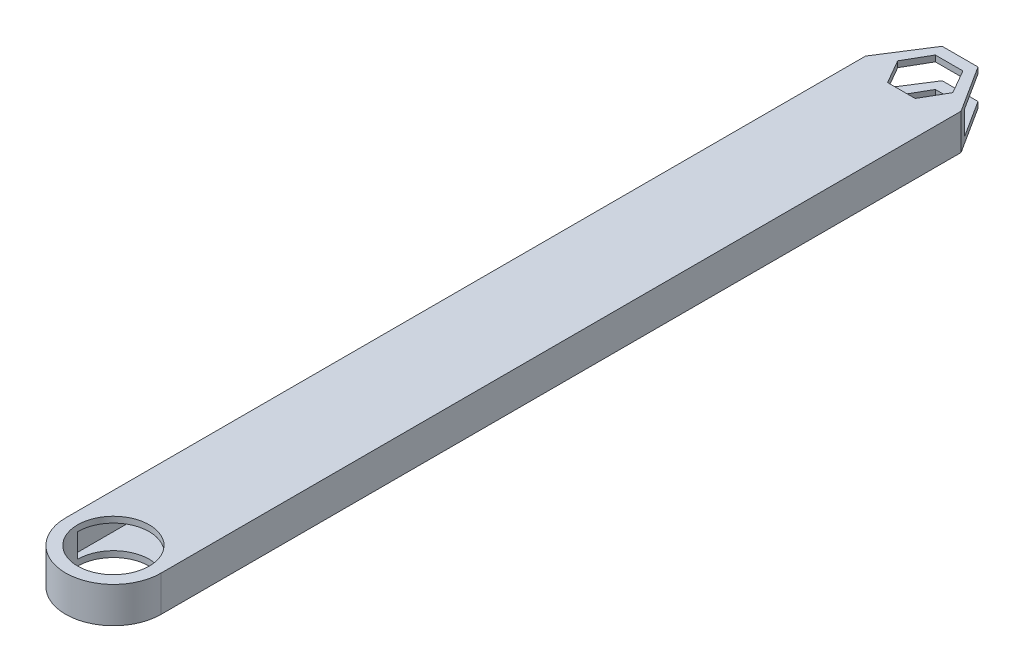
ISO-10303-21;
HEADER;
FILE_DESCRIPTION(('STEP AP214'),'2;1');
FILE_NAME('part.step','',(''),(''),'','','');
FILE_SCHEMA(('AUTOMOTIVE_DESIGN { 1 0 10303 214 1 1 1 1 }'));
ENDSEC;
DATA;
#1=APPLICATION_CONTEXT('core data for automotive mechanical design processes');
#2=APPLICATION_PROTOCOL_DEFINITION('international standard','automotive_design',2000,#1);
#3=PRODUCT_CONTEXT('',#1,'mechanical');
#4=PRODUCT('Part','Part','',(#3));
#5=PRODUCT_RELATED_PRODUCT_CATEGORY('part','',(#4));
#6=PRODUCT_DEFINITION_FORMATION('','',#4);
#7=PRODUCT_DEFINITION_CONTEXT('part definition',#1,'design');
#8=PRODUCT_DEFINITION('design','',#6,#7);
#9=PRODUCT_DEFINITION_SHAPE('','',#8);
#10=(LENGTH_UNIT() NAMED_UNIT(*) SI_UNIT(.MILLI.,.METRE.));
#11=(NAMED_UNIT(*) PLANE_ANGLE_UNIT() SI_UNIT($,.RADIAN.));
#12=(NAMED_UNIT(*) SI_UNIT($,.STERADIAN.) SOLID_ANGLE_UNIT());
#13=UNCERTAINTY_MEASURE_WITH_UNIT(LENGTH_MEASURE(1.E-05),#10,'distance_accuracy_value','');
#14=(GEOMETRIC_REPRESENTATION_CONTEXT(3) GLOBAL_UNCERTAINTY_ASSIGNED_CONTEXT((#13)) GLOBAL_UNIT_ASSIGNED_CONTEXT((#10,
#11,#12)) REPRESENTATION_CONTEXT('',''));
#15=CARTESIAN_POINT('',(0.,0.,0.));
#16=DIRECTION('',(0.,0.,1.));
#17=DIRECTION('',(1.,0.,0.));
#18=AXIS2_PLACEMENT_3D('',#15,#16,#17);
#19=CARTESIAN_POINT('',(0.,0.,228.6));
#20=DIRECTION('',(0.,0.,-1.));
#21=DIRECTION('',(-1.,0.,0.));
#22=AXIS2_PLACEMENT_3D('',#19,#20,#21);
#23=PLANE('',#22);
#24=DIRECTION('',(0.,1.,0.));
#25=VECTOR('',#24,1.);
#26=CARTESIAN_POINT('',(3.175,0.,228.6));
#27=LINE('',#26,#25);
#28=CARTESIAN_POINT('',(3.175,1.5875,228.6));
#29=VERTEX_POINT('',#28);
#30=CARTESIAN_POINT('',(3.175,7.9375,228.6));
#31=VERTEX_POINT('',#30);
#32=EDGE_CURVE('E11',#29,#31,#27,.T.);
#33=ORIENTED_EDGE('',*,*,#32,.F.);
#34=DIRECTION('',(1.,0.,0.));
#35=VECTOR('',#34,1.);
#36=CARTESIAN_POINT('',(1.5875,1.5875,228.6));
#37=LINE('',#36,#35);
#38=CARTESIAN_POINT('',(1.5875,1.5875,228.6));
#39=VERTEX_POINT('',#38);
#40=EDGE_CURVE('E221',#39,#29,#37,.T.);
#41=ORIENTED_EDGE('',*,*,#40,.F.);
#42=DIRECTION('',(0.,-1.,0.));
#43=VECTOR('',#42,1.);
#44=CARTESIAN_POINT('',(1.5875,7.9375,228.6));
#45=LINE('',#44,#43);
#46=CARTESIAN_POINT('',(1.5875,7.9375,228.6));
#47=VERTEX_POINT('',#46);
#48=EDGE_CURVE('E228',#47,#39,#45,.T.);
#49=ORIENTED_EDGE('',*,*,#48,.F.);
#50=DIRECTION('',(-1.,0.,0.));
#51=VECTOR('',#50,1.);
#52=CARTESIAN_POINT('',(23.8125,7.9375,228.6));
#53=LINE('',#52,#51);
#54=EDGE_CURVE('E385',#31,#47,#53,.T.);
#55=ORIENTED_EDGE('',*,*,#54,.F.);
#56=EDGE_LOOP('',(#33,#41,#49,#55));
#57=FACE_BOUND('',#56,.T.);
#58=ADVANCED_FACE('F35',(#57),#23,.T.);
#59=CARTESIAN_POINT('',(0.,0.,228.6));
#60=DIRECTION('',(1.,0.,0.));
#61=DIRECTION('',(0.,0.,-1.));
#62=AXIS2_PLACEMENT_3D('',#59,#60,#61);
#63=PLANE('',#62);
#64=DIRECTION('',(0.,0.,-1.));
#65=VECTOR('',#64,1.);
#66=CARTESIAN_POINT('',(0.,9.525,228.6));
#67=LINE('',#66,#65);
#68=CARTESIAN_POINT('',(0.,9.525,228.6));
#69=VERTEX_POINT('',#68);
#70=CARTESIAN_POINT('',(0.,9.525,15.875));
#71=VERTEX_POINT('',#70);
#72=EDGE_CURVE('E252',#69,#71,#67,.T.);
#73=ORIENTED_EDGE('',*,*,#72,.T.);
#74=DIRECTION('',(0.,1.,0.));
#75=VECTOR('',#74,1.);
#76=CARTESIAN_POINT('',(0.,0.,15.875));
#77=LINE('',#76,#75);
#78=CARTESIAN_POINT('',(0.,0.,15.875));
#79=VERTEX_POINT('',#78);
#80=EDGE_CURVE('E57',#79,#71,#77,.T.);
#81=ORIENTED_EDGE('',*,*,#80,.F.);
#82=DIRECTION('',(0.,0.,-1.));
#83=VECTOR('',#82,1.);
#84=CARTESIAN_POINT('',(0.,0.,228.6));
#85=LINE('',#84,#83);
#86=CARTESIAN_POINT('',(0.,0.,228.6));
#87=VERTEX_POINT('',#86);
#88=EDGE_CURVE('E261',#87,#79,#85,.T.);
#89=ORIENTED_EDGE('',*,*,#88,.F.);
#90=DIRECTION('',(0.,-1.,0.));
#91=VECTOR('',#90,1.);
#92=CARTESIAN_POINT('',(0.,0.,228.6));
#93=LINE('',#92,#91);
#94=EDGE_CURVE('E240',#69,#87,#93,.T.);
#95=ORIENTED_EDGE('',*,*,#94,.F.);
#96=EDGE_LOOP('',(#73,#81,#89,#95));
#97=FACE_BOUND('',#96,.T.);
#98=ADVANCED_FACE('F37',(#97),#63,.F.);
#99=CARTESIAN_POINT('',(0.,0.,228.6));
#100=DIRECTION('',(0.,1.,0.));
#101=DIRECTION('',(0.,0.,1.));
#102=AXIS2_PLACEMENT_3D('',#99,#100,#101);
#103=PLANE('',#102);
#104=CARTESIAN_POINT('',(12.7,0.,228.6));
#105=DIRECTION('',(0.,1.,0.));
#106=DIRECTION('',(0.,0.,1.));
#107=AXIS2_PLACEMENT_3D('',#104,#105,#106);
#108=CIRCLE('',#107,9.525);
#109=CARTESIAN_POINT('',(12.7,0.,238.125));
#110=VERTEX_POINT('',#109);
#111=EDGE_CURVE('E222',#110,#110,#108,.T.);
#112=ORIENTED_EDGE('',*,*,#111,.T.);
#113=EDGE_LOOP('',(#112));
#114=FACE_BOUND('',#113,.T.);
#115=DIRECTION('',(-0.5,0.,0.866025403784439));
#116=VECTOR('',#115,1.);
#117=CARTESIAN_POINT('',(20.0323484187082,0.,12.7));
#118=LINE('',#117,#116);
#119=CARTESIAN_POINT('',(20.0323484187082,0.,12.7));
#120=VERTEX_POINT('',#119);
#121=CARTESIAN_POINT('',(16.3661742093541,0.,19.05));
#122=VERTEX_POINT('',#121);
#123=EDGE_CURVE('E332',#120,#122,#118,.T.);
#124=ORIENTED_EDGE('',*,*,#123,.F.);
#125=DIRECTION('',(0.499999999999999,0.,0.866025403784439));
#126=VECTOR('',#125,1.);
#127=CARTESIAN_POINT('',(16.3661742093541,0.,6.35));
#128=LINE('',#127,#126);
#129=CARTESIAN_POINT('',(16.3661742093541,0.,6.35));
#130=VERTEX_POINT('',#129);
#131=EDGE_CURVE('E304',#130,#120,#128,.T.);
#132=ORIENTED_EDGE('',*,*,#131,.F.);
#133=DIRECTION('',(1.,0.,0.));
#134=VECTOR('',#133,1.);
#135=CARTESIAN_POINT('',(9.03382579064587,0.,6.35));
#136=LINE('',#135,#134);
#137=CARTESIAN_POINT('',(9.03382579064587,0.,6.35));
#138=VERTEX_POINT('',#137);
#139=EDGE_CURVE('E315',#138,#130,#136,.T.);
#140=ORIENTED_EDGE('',*,*,#139,.F.);
#141=DIRECTION('',(0.5,0.,-0.866025403784439));
#142=VECTOR('',#141,1.);
#143=CARTESIAN_POINT('',(5.36765158129175,0.,12.7));
#144=LINE('',#143,#142);
#145=CARTESIAN_POINT('',(5.36765158129175,0.,12.7));
#146=VERTEX_POINT('',#145);
#147=EDGE_CURVE('E341',#146,#138,#144,.T.);
#148=ORIENTED_EDGE('',*,*,#147,.F.);
#149=DIRECTION('',(-0.5,0.,-0.866025403784439));
#150=VECTOR('',#149,1.);
#151=CARTESIAN_POINT('',(9.03382579064587,0.,19.05));
#152=LINE('',#151,#150);
#153=CARTESIAN_POINT('',(9.03382579064587,0.,19.05));
#154=VERTEX_POINT('',#153);
#155=EDGE_CURVE('E338',#154,#146,#152,.T.);
#156=ORIENTED_EDGE('',*,*,#155,.F.);
#157=DIRECTION('',(-1.,0.,0.));
#158=VECTOR('',#157,1.);
#159=CARTESIAN_POINT('',(16.3661742093541,0.,19.05));
#160=LINE('',#159,#158);
#161=EDGE_CURVE('E335',#122,#154,#160,.T.);
#162=ORIENTED_EDGE('',*,*,#161,.F.);
#163=EDGE_LOOP('',(#124,#132,#140,#148,#156,#162));
#164=FACE_BOUND('',#163,.T.);
#165=DIRECTION('',(1.,0.,0.));
#166=VECTOR('',#165,1.);
#167=CARTESIAN_POINT('',(17.4625,0.,3.43247813906236));
#168=LINE('',#167,#166);
#169=CARTESIAN_POINT('',(7.9375,0.,3.43247813906236));
#170=VERTEX_POINT('',#169);
#171=CARTESIAN_POINT('',(17.4625,0.,3.43247813906236));
#172=VERTEX_POINT('',#171);
#173=EDGE_CURVE('E423',#170,#172,#168,.T.);
#174=ORIENTED_EDGE('',*,*,#173,.T.);
#175=DIRECTION('',(0.537817098940404,0.,0.843061544661674));
#176=VECTOR('',#175,1.);
#177=CARTESIAN_POINT('',(25.4,0.,15.875));
#178=LINE('',#177,#176);
#179=CARTESIAN_POINT('',(25.4,0.,15.875));
#180=VERTEX_POINT('',#179);
#181=EDGE_CURVE('E407',#172,#180,#178,.T.);
#182=ORIENTED_EDGE('',*,*,#181,.T.);
#183=DIRECTION('',(0.,0.,-1.));
#184=VECTOR('',#183,1.);
#185=CARTESIAN_POINT('',(25.4,0.,228.6));
#186=LINE('',#185,#184);
#187=CARTESIAN_POINT('',(25.4,0.,228.6));
#188=VERTEX_POINT('',#187);
#189=EDGE_CURVE('E258',#188,#180,#186,.T.);
#190=ORIENTED_EDGE('',*,*,#189,.F.);
#191=CARTESIAN_POINT('',(12.7,0.,228.6));
#192=DIRECTION('',(0.,1.,0.));
#193=DIRECTION('',(0.,0.,1.));
#194=AXIS2_PLACEMENT_3D('',#191,#192,#193);
#195=CIRCLE('',#194,12.7);
#196=EDGE_CURVE('E420',#87,#188,#195,.T.);
#197=ORIENTED_EDGE('',*,*,#196,.F.);
#198=ORIENTED_EDGE('',*,*,#88,.T.);
#199=DIRECTION('',(0.537817098940404,0.,-0.843061544661674));
#200=VECTOR('',#199,1.);
#201=CARTESIAN_POINT('',(7.9375,0.,3.43247813906236));
#202=LINE('',#201,#200);
#203=EDGE_CURVE('E414',#79,#170,#202,.T.);
#204=ORIENTED_EDGE('',*,*,#203,.T.);
#205=EDGE_LOOP('',(#174,#182,#190,#197,#198,#204));
#206=FACE_BOUND('',#205,.T.);
#207=ADVANCED_FACE('F440',(#114,#164,#206),#103,.F.);
#208=CARTESIAN_POINT('',(25.4,0.,228.6));
#209=DIRECTION('',(-1.,0.,0.));
#210=DIRECTION('',(0.,0.,1.));
#211=AXIS2_PLACEMENT_3D('',#208,#209,#210);
#212=PLANE('',#211);
#213=ORIENTED_EDGE('',*,*,#189,.T.);
#214=DIRECTION('',(0.,1.,0.));
#215=VECTOR('',#214,1.);
#216=CARTESIAN_POINT('',(25.4,0.,15.875));
#217=LINE('',#216,#215);
#218=CARTESIAN_POINT('',(25.4,9.525,15.875));
#219=VERTEX_POINT('',#218);
#220=EDGE_CURVE('E400',#180,#219,#217,.T.);
#221=ORIENTED_EDGE('',*,*,#220,.T.);
#222=DIRECTION('',(0.,0.,-1.));
#223=VECTOR('',#222,1.);
#224=CARTESIAN_POINT('',(25.4,9.525,228.6));
#225=LINE('',#224,#223);
#226=CARTESIAN_POINT('',(25.4,9.525,228.6));
#227=VERTEX_POINT('',#226);
#228=EDGE_CURVE('E255',#227,#219,#225,.T.);
#229=ORIENTED_EDGE('',*,*,#228,.F.);
#230=DIRECTION('',(0.,1.,0.));
#231=VECTOR('',#230,1.);
#232=CARTESIAN_POINT('',(25.4,0.,228.6));
#233=LINE('',#232,#231);
#234=EDGE_CURVE('E249',#188,#227,#233,.T.);
#235=ORIENTED_EDGE('',*,*,#234,.F.);
#236=EDGE_LOOP('',(#213,#221,#229,#235));
#237=FACE_BOUND('',#236,.T.);
#238=ADVANCED_FACE('F451',(#237),#212,.F.);
#239=CARTESIAN_POINT('',(0.,9.525,228.6));
#240=DIRECTION('',(0.,-1.,0.));
#241=DIRECTION('',(0.,0.,-1.));
#242=AXIS2_PLACEMENT_3D('',#239,#240,#241);
#243=PLANE('',#242);
#244=CARTESIAN_POINT('',(12.7,9.525,228.6));
#245=DIRECTION('',(0.,1.,0.));
#246=DIRECTION('',(0.,0.,1.));
#247=AXIS2_PLACEMENT_3D('',#244,#245,#246);
#248=CIRCLE('',#247,9.525);
#249=CARTESIAN_POINT('',(12.7,9.525,238.125));
#250=VERTEX_POINT('',#249);
#251=EDGE_CURVE('E434',#250,#250,#248,.T.);
#252=ORIENTED_EDGE('',*,*,#251,.F.);
#253=EDGE_LOOP('',(#252));
#254=FACE_BOUND('',#253,.T.);
#255=DIRECTION('',(1.,0.,0.));
#256=VECTOR('',#255,1.);
#257=CARTESIAN_POINT('',(9.03382579064587,9.525,6.35));
#258=LINE('',#257,#256);
#259=CARTESIAN_POINT('',(9.03382579064587,9.525,6.35));
#260=VERTEX_POINT('',#259);
#261=CARTESIAN_POINT('',(16.3661742093541,9.525,6.35));
#262=VERTEX_POINT('',#261);
#263=EDGE_CURVE('E327',#260,#262,#258,.T.);
#264=ORIENTED_EDGE('',*,*,#263,.T.);
#265=DIRECTION('',(0.499999999999999,0.,0.866025403784439));
#266=VECTOR('',#265,1.);
#267=CARTESIAN_POINT('',(16.3661742093541,9.525,6.35));
#268=LINE('',#267,#266);
#269=CARTESIAN_POINT('',(20.0323484187082,9.525,12.7));
#270=VERTEX_POINT('',#269);
#271=EDGE_CURVE('E311',#262,#270,#268,.T.);
#272=ORIENTED_EDGE('',*,*,#271,.T.);
#273=DIRECTION('',(-0.5,0.,0.866025403784439));
#274=VECTOR('',#273,1.);
#275=CARTESIAN_POINT('',(20.0323484187082,9.525,12.7));
#276=LINE('',#275,#274);
#277=CARTESIAN_POINT('',(16.3661742093541,9.525,19.05));
#278=VERTEX_POINT('',#277);
#279=EDGE_CURVE('E314',#270,#278,#276,.T.);
#280=ORIENTED_EDGE('',*,*,#279,.T.);
#281=DIRECTION('',(-1.,0.,0.));
#282=VECTOR('',#281,1.);
#283=CARTESIAN_POINT('',(16.3661742093541,9.525,19.05));
#284=LINE('',#283,#282);
#285=CARTESIAN_POINT('',(9.03382579064587,9.525,19.05));
#286=VERTEX_POINT('',#285);
#287=EDGE_CURVE('E318',#278,#286,#284,.T.);
#288=ORIENTED_EDGE('',*,*,#287,.T.);
#289=DIRECTION('',(-0.5,0.,-0.866025403784439));
#290=VECTOR('',#289,1.);
#291=CARTESIAN_POINT('',(9.03382579064587,9.525,19.05));
#292=LINE('',#291,#290);
#293=CARTESIAN_POINT('',(5.36765158129175,9.525,12.7));
#294=VERTEX_POINT('',#293);
#295=EDGE_CURVE('E321',#286,#294,#292,.T.);
#296=ORIENTED_EDGE('',*,*,#295,.T.);
#297=DIRECTION('',(0.5,0.,-0.866025403784439));
#298=VECTOR('',#297,1.);
#299=CARTESIAN_POINT('',(5.36765158129175,9.525,12.7));
#300=LINE('',#299,#298);
#301=EDGE_CURVE('E324',#294,#260,#300,.T.);
#302=ORIENTED_EDGE('',*,*,#301,.T.);
#303=EDGE_LOOP('',(#264,#272,#280,#288,#296,#302));
#304=FACE_BOUND('',#303,.T.);
#305=ORIENTED_EDGE('',*,*,#228,.T.);
#306=DIRECTION('',(0.537817098940404,0.,0.843061544661674));
#307=VECTOR('',#306,1.);
#308=CARTESIAN_POINT('',(25.4,9.525,15.875));
#309=LINE('',#308,#307);
#310=CARTESIAN_POINT('',(17.4625,9.525,3.43247813906236));
#311=VERTEX_POINT('',#310);
#312=EDGE_CURVE('E412',#311,#219,#309,.T.);
#313=ORIENTED_EDGE('',*,*,#312,.F.);
#314=DIRECTION('',(1.,0.,0.));
#315=VECTOR('',#314,1.);
#316=CARTESIAN_POINT('',(17.4625,9.525,3.43247813906236));
#317=LINE('',#316,#315);
#318=CARTESIAN_POINT('',(7.9375,9.525,3.43247813906236));
#319=VERTEX_POINT('',#318);
#320=EDGE_CURVE('E415',#319,#311,#317,.T.);
#321=ORIENTED_EDGE('',*,*,#320,.F.);
#322=DIRECTION('',(0.537817098940404,0.,-0.843061544661674));
#323=VECTOR('',#322,1.);
#324=CARTESIAN_POINT('',(7.9375,9.525,3.43247813906236));
#325=LINE('',#324,#323);
#326=EDGE_CURVE('E418',#71,#319,#325,.T.);
#327=ORIENTED_EDGE('',*,*,#326,.F.);
#328=ORIENTED_EDGE('',*,*,#72,.F.);
#329=CARTESIAN_POINT('',(12.7,9.525,228.6));
#330=DIRECTION('',(0.,1.,0.));
#331=DIRECTION('',(0.,0.,1.));
#332=AXIS2_PLACEMENT_3D('',#329,#330,#331);
#333=CIRCLE('',#332,12.7);
#334=EDGE_CURVE('E428',#69,#227,#333,.T.);
#335=ORIENTED_EDGE('',*,*,#334,.T.);
#336=EDGE_LOOP('',(#305,#313,#321,#327,#328,#335));
#337=FACE_BOUND('',#336,.T.);
#338=ADVANCED_FACE('F448',(#254,#304,#337),#243,.F.);
#339=CARTESIAN_POINT('',(23.8125,7.9375,0.));
#340=DIRECTION('',(0.,1.,0.));
#341=DIRECTION('',(0.,0.,1.));
#342=AXIS2_PLACEMENT_3D('',#339,#340,#341);
#343=PLANE('',#342);
#344=DIRECTION('',(0.5,0.,-0.866025403784439));
#345=VECTOR('',#344,1.);
#346=CARTESIAN_POINT('',(26.4766476280624,7.9375,1.53814635022271));
#347=LINE('',#346,#345);
#348=CARTESIAN_POINT('',(16.3661742093541,7.9375,19.05));
#349=VERTEX_POINT('',#348);
#350=CARTESIAN_POINT('',(20.0323484187082,7.9375,12.7));
#351=VERTEX_POINT('',#350);
#352=EDGE_CURVE('E349',#349,#351,#347,.T.);
#353=ORIENTED_EDGE('',*,*,#352,.T.);
#354=DIRECTION('',(-0.499999999999999,0.,-0.866025403784439));
#355=VECTOR('',#354,1.);
#356=CARTESIAN_POINT('',(15.478125,7.9375,4.81185364977728));
#357=LINE('',#356,#355);
#358=CARTESIAN_POINT('',(16.3661742093541,7.9375,6.35));
#359=VERTEX_POINT('',#358);
#360=EDGE_CURVE('E383',#351,#359,#357,.T.);
#361=ORIENTED_EDGE('',*,*,#360,.T.);
#362=DIRECTION('',(-1.,0.,0.));
#363=VECTOR('',#362,1.);
#364=CARTESIAN_POINT('',(23.8125,7.9375,6.35));
#365=LINE('',#364,#363);
#366=CARTESIAN_POINT('',(9.03382579064587,7.9375,6.35));
#367=VERTEX_POINT('',#366);
#368=EDGE_CURVE('E380',#359,#367,#365,.T.);
#369=ORIENTED_EDGE('',*,*,#368,.T.);
#370=DIRECTION('',(-0.5,0.,0.866025403784439));
#371=VECTOR('',#370,1.);
#372=CARTESIAN_POINT('',(15.478125,7.9375,-4.81185364977729));
#373=LINE('',#372,#371);
#374=CARTESIAN_POINT('',(5.36765158129175,7.9375,12.7));
#375=VERTEX_POINT('',#374);
#376=EDGE_CURVE('E377',#367,#375,#373,.T.);
#377=ORIENTED_EDGE('',*,*,#376,.T.);
#378=DIRECTION('',(0.5,0.,0.866025403784439));
#379=VECTOR('',#378,1.);
#380=CARTESIAN_POINT('',(4.47960237193762,7.9375,11.1618536497773));
#381=LINE('',#380,#379);
#382=CARTESIAN_POINT('',(9.03382579064587,7.9375,19.05));
#383=VERTEX_POINT('',#382);
#384=EDGE_CURVE('E374',#375,#383,#381,.T.);
#385=ORIENTED_EDGE('',*,*,#384,.T.);
#386=DIRECTION('',(1.,0.,0.));
#387=VECTOR('',#386,1.);
#388=CARTESIAN_POINT('',(23.8125,7.9375,19.05));
#389=LINE('',#388,#387);
#390=EDGE_CURVE('E371',#383,#349,#389,.T.);
#391=ORIENTED_EDGE('',*,*,#390,.T.);
#392=EDGE_LOOP('',(#353,#361,#369,#377,#385,#391));
#393=FACE_BOUND('',#392,.T.);
#394=CARTESIAN_POINT('',(23.8125,7.9375,228.6));
#395=VERTEX_POINT('',#394);
#396=CARTESIAN_POINT('',(22.225,7.9375,228.6));
#397=VERTEX_POINT('',#396);
#398=EDGE_CURVE('E231',#395,#397,#53,.T.);
#399=ORIENTED_EDGE('',*,*,#398,.T.);
#400=CARTESIAN_POINT('',(12.7,7.9375,228.6));
#401=DIRECTION('',(0.,1.,0.));
#402=DIRECTION('',(0.,0.,1.));
#403=AXIS2_PLACEMENT_3D('',#400,#401,#402);
#404=CIRCLE('',#403,9.525);
#405=EDGE_CURVE('E49',#397,#31,#404,.T.);
#406=ORIENTED_EDGE('',*,*,#405,.T.);
#407=ORIENTED_EDGE('',*,*,#54,.T.);
#408=DIRECTION('',(0.,0.,1.));
#409=VECTOR('',#408,1.);
#410=CARTESIAN_POINT('',(1.5875,7.9375,0.));
#411=LINE('',#410,#409);
#412=CARTESIAN_POINT('',(1.5875,7.9375,13.3864956278125));
#413=VERTEX_POINT('',#412);
#414=EDGE_CURVE('E236',#413,#47,#411,.T.);
#415=ORIENTED_EDGE('',*,*,#414,.F.);
#416=DIRECTION('',(0.537817098940404,0.,-0.843061544661674));
#417=VECTOR('',#416,1.);
#418=CARTESIAN_POINT('',(14.0856297224988,7.9375,-6.2050952122537));
#419=LINE('',#418,#417);
#420=CARTESIAN_POINT('',(7.9375,7.9375,3.43247813906236));
#421=VERTEX_POINT('',#420);
#422=EDGE_CURVE('E307',#413,#421,#419,.T.);
#423=ORIENTED_EDGE('',*,*,#422,.T.);
#424=DIRECTION('',(1.,0.,0.));
#425=VECTOR('',#424,1.);
#426=CARTESIAN_POINT('',(23.8125,7.9375,3.43247813906236));
#427=LINE('',#426,#425);
#428=CARTESIAN_POINT('',(17.4625,7.9375,3.43247813906236));
#429=VERTEX_POINT('',#428);
#430=EDGE_CURVE('E302',#421,#429,#427,.T.);
#431=ORIENTED_EDGE('',*,*,#430,.T.);
#432=DIRECTION('',(0.537817098940404,0.,0.843061544661674));
#433=VECTOR('',#432,1.);
#434=CARTESIAN_POINT('',(17.7428900067604,7.9375,3.87200680535585));
#435=LINE('',#434,#433);
#436=CARTESIAN_POINT('',(23.8125,7.9375,13.3864956278125));
#437=VERTEX_POINT('',#436);
#438=EDGE_CURVE('E301',#429,#437,#435,.T.);
#439=ORIENTED_EDGE('',*,*,#438,.T.);
#440=DIRECTION('',(0.,0.,1.));
#441=VECTOR('',#440,1.);
#442=CARTESIAN_POINT('',(23.8125,7.9375,0.));
#443=LINE('',#442,#441);
#444=EDGE_CURVE('E237',#437,#395,#443,.T.);
#445=ORIENTED_EDGE('',*,*,#444,.T.);
#446=EDGE_LOOP('',(#399,#406,#407,#415,#423,#431,#439,#445));
#447=FACE_BOUND('',#446,.T.);
#448=ADVANCED_FACE('F390',(#393,#447),#343,.F.);
#449=CARTESIAN_POINT('',(23.8125,1.5875,0.));
#450=DIRECTION('',(1.,0.,0.));
#451=DIRECTION('',(0.,0.,-1.));
#452=AXIS2_PLACEMENT_3D('',#449,#450,#451);
#453=PLANE('',#452);
#454=ORIENTED_EDGE('',*,*,#444,.F.);
#455=DIRECTION('',(0.,-1.,0.));
#456=VECTOR('',#455,1.);
#457=CARTESIAN_POINT('',(23.8125,1.5875,13.3864956278125));
#458=LINE('',#457,#456);
#459=CARTESIAN_POINT('',(23.8125,1.5875,13.3864956278125));
#460=VERTEX_POINT('',#459);
#461=EDGE_CURVE('E294',#437,#460,#458,.T.);
#462=ORIENTED_EDGE('',*,*,#461,.T.);
#463=DIRECTION('',(0.,0.,1.));
#464=VECTOR('',#463,1.);
#465=CARTESIAN_POINT('',(23.8125,1.5875,0.));
#466=LINE('',#465,#464);
#467=CARTESIAN_POINT('',(23.8125,1.5875,228.6));
#468=VERTEX_POINT('',#467);
#469=EDGE_CURVE('E241',#460,#468,#466,.T.);
#470=ORIENTED_EDGE('',*,*,#469,.T.);
#471=DIRECTION('',(0.,1.,0.));
#472=VECTOR('',#471,1.);
#473=CARTESIAN_POINT('',(23.8125,1.5875,228.6));
#474=LINE('',#473,#472);
#475=EDGE_CURVE('E226',#468,#395,#474,.T.);
#476=ORIENTED_EDGE('',*,*,#475,.T.);
#477=EDGE_LOOP('',(#454,#462,#470,#476));
#478=FACE_BOUND('',#477,.T.);
#479=ADVANCED_FACE('F300',(#478),#453,.F.);
#480=CARTESIAN_POINT('',(1.5875,1.5875,0.));
#481=DIRECTION('',(0.,-1.,0.));
#482=DIRECTION('',(0.,0.,-1.));
#483=AXIS2_PLACEMENT_3D('',#480,#481,#482);
#484=PLANE('',#483);
#485=DIRECTION('',(1.,0.,0.));
#486=VECTOR('',#485,1.);
#487=CARTESIAN_POINT('',(1.5875,1.5875,6.35));
#488=LINE('',#487,#486);
#489=CARTESIAN_POINT('',(9.03382579064587,1.5875,6.35));
#490=VERTEX_POINT('',#489);
#491=CARTESIAN_POINT('',(16.3661742093541,1.5875,6.35));
#492=VERTEX_POINT('',#491);
#493=EDGE_CURVE('E276',#490,#492,#488,.T.);
#494=ORIENTED_EDGE('',*,*,#493,.T.);
#495=DIRECTION('',(0.499999999999999,0.,0.866025403784439));
#496=VECTOR('',#495,1.);
#497=CARTESIAN_POINT('',(9.92187500000001,1.5875,-4.81185364977729));
#498=LINE('',#497,#496);
#499=CARTESIAN_POINT('',(20.0323484187082,1.5875,12.7));
#500=VERTEX_POINT('',#499);
#501=EDGE_CURVE('E279',#492,#500,#498,.T.);
#502=ORIENTED_EDGE('',*,*,#501,.T.);
#503=DIRECTION('',(-0.5,0.,0.866025403784439));
#504=VECTOR('',#503,1.);
#505=CARTESIAN_POINT('',(20.9203976280624,1.5875,11.1618536497773));
#506=LINE('',#505,#504);
#507=CARTESIAN_POINT('',(16.3661742093541,1.5875,19.05));
#508=VERTEX_POINT('',#507);
#509=EDGE_CURVE('E264',#500,#508,#506,.T.);
#510=ORIENTED_EDGE('',*,*,#509,.T.);
#511=DIRECTION('',(-1.,0.,0.));
#512=VECTOR('',#511,1.);
#513=CARTESIAN_POINT('',(1.5875,1.5875,19.05));
#514=LINE('',#513,#512);
#515=CARTESIAN_POINT('',(9.03382579064587,1.5875,19.05));
#516=VERTEX_POINT('',#515);
#517=EDGE_CURVE('E267',#508,#516,#514,.T.);
#518=ORIENTED_EDGE('',*,*,#517,.T.);
#519=DIRECTION('',(-0.5,0.,-0.866025403784439));
#520=VECTOR('',#519,1.);
#521=CARTESIAN_POINT('',(-1.07664762806238,1.5875,1.53814635022272));
#522=LINE('',#521,#520);
#523=CARTESIAN_POINT('',(5.36765158129175,1.5875,12.7));
#524=VERTEX_POINT('',#523);
#525=EDGE_CURVE('E270',#516,#524,#522,.T.);
#526=ORIENTED_EDGE('',*,*,#525,.T.);
#527=DIRECTION('',(0.5,0.,-0.866025403784439));
#528=VECTOR('',#527,1.);
#529=CARTESIAN_POINT('',(9.921875,1.5875,4.81185364977728));
#530=LINE('',#529,#528);
#531=EDGE_CURVE('E273',#524,#490,#530,.T.);
#532=ORIENTED_EDGE('',*,*,#531,.T.);
#533=EDGE_LOOP('',(#494,#502,#510,#518,#526,#532));
#534=FACE_BOUND('',#533,.T.);
#535=ORIENTED_EDGE('',*,*,#40,.T.);
#536=CARTESIAN_POINT('',(12.7,1.5875,228.6));
#537=DIRECTION('',(0.,-1.,0.));
#538=DIRECTION('',(0.,0.,-1.));
#539=AXIS2_PLACEMENT_3D('',#536,#537,#538);
#540=CIRCLE('',#539,9.525);
#541=CARTESIAN_POINT('',(22.225,1.5875,228.6));
#542=VERTEX_POINT('',#541);
#543=EDGE_CURVE('E208',#29,#542,#540,.T.);
#544=ORIENTED_EDGE('',*,*,#543,.T.);
#545=EDGE_CURVE('E218',#542,#468,#37,.T.);
#546=ORIENTED_EDGE('',*,*,#545,.T.);
#547=ORIENTED_EDGE('',*,*,#469,.F.);
#548=DIRECTION('',(-0.537817098940404,0.,-0.843061544661674));
#549=VECTOR('',#548,1.);
#550=CARTESIAN_POINT('',(11.3143702775012,1.5875,-6.2050952122537));
#551=LINE('',#550,#549);
#552=CARTESIAN_POINT('',(17.4625,1.5875,3.43247813906236));
#553=VERTEX_POINT('',#552);
#554=EDGE_CURVE('E213',#460,#553,#551,.T.);
#555=ORIENTED_EDGE('',*,*,#554,.T.);
#556=DIRECTION('',(-1.,0.,0.));
#557=VECTOR('',#556,1.);
#558=CARTESIAN_POINT('',(1.5875,1.5875,3.43247813906236));
#559=LINE('',#558,#557);
#560=CARTESIAN_POINT('',(7.9375,1.5875,3.43247813906236));
#561=VERTEX_POINT('',#560);
#562=EDGE_CURVE('E285',#553,#561,#559,.T.);
#563=ORIENTED_EDGE('',*,*,#562,.T.);
#564=DIRECTION('',(-0.537817098940404,0.,0.843061544661674));
#565=VECTOR('',#564,1.);
#566=CARTESIAN_POINT('',(7.65710999323961,1.5875,3.87200680535585));
#567=LINE('',#566,#565);
#568=CARTESIAN_POINT('',(1.5875,1.5875,13.3864956278125));
#569=VERTEX_POINT('',#568);
#570=EDGE_CURVE('E397',#561,#569,#567,.T.);
#571=ORIENTED_EDGE('',*,*,#570,.T.);
#572=DIRECTION('',(0.,0.,1.));
#573=VECTOR('',#572,1.);
#574=CARTESIAN_POINT('',(1.5875,1.5875,0.));
#575=LINE('',#574,#573);
#576=EDGE_CURVE('E243',#569,#39,#575,.T.);
#577=ORIENTED_EDGE('',*,*,#576,.T.);
#578=EDGE_LOOP('',(#535,#544,#546,#547,#555,#563,#571,#577));
#579=FACE_BOUND('',#578,.T.);
#580=ADVANCED_FACE('F216',(#534,#579),#484,.F.);
#581=CARTESIAN_POINT('',(1.5875,7.9375,0.));
#582=DIRECTION('',(-1.,0.,0.));
#583=DIRECTION('',(0.,0.,1.));
#584=AXIS2_PLACEMENT_3D('',#581,#582,#583);
#585=PLANE('',#584);
#586=ORIENTED_EDGE('',*,*,#576,.F.);
#587=DIRECTION('',(0.,1.,0.));
#588=VECTOR('',#587,1.);
#589=CARTESIAN_POINT('',(1.5875,7.9375,13.3864956278125));
#590=LINE('',#589,#588);
#591=EDGE_CURVE('E282',#569,#413,#590,.T.);
#592=ORIENTED_EDGE('',*,*,#591,.T.);
#593=ORIENTED_EDGE('',*,*,#414,.T.);
#594=ORIENTED_EDGE('',*,*,#48,.T.);
#595=EDGE_LOOP('',(#586,#592,#593,#594));
#596=FACE_BOUND('',#595,.T.);
#597=ADVANCED_FACE('F395',(#596),#585,.F.);
#598=CARTESIAN_POINT('',(20.0323484187082,9.525,12.7));
#599=DIRECTION('',(0.866025403784439,0.,0.5));
#600=DIRECTION('',(0.5,0.,-0.866025403784439));
#601=AXIS2_PLACEMENT_3D('',#598,#599,#600);
#602=PLANE('',#601);
#603=DIRECTION('',(0.,-1.,0.));
#604=VECTOR('',#603,1.);
#605=CARTESIAN_POINT('',(20.0323484187082,9.525,12.7));
#606=LINE('',#605,#604);
#607=EDGE_CURVE('E330',#500,#120,#606,.T.);
#608=ORIENTED_EDGE('',*,*,#607,.T.);
#609=ORIENTED_EDGE('',*,*,#123,.T.);
#610=DIRECTION('',(0.,-1.,0.));
#611=VECTOR('',#610,1.);
#612=CARTESIAN_POINT('',(16.3661742093541,9.525,19.05));
#613=LINE('',#612,#611);
#614=EDGE_CURVE('E366',#508,#122,#613,.T.);
#615=ORIENTED_EDGE('',*,*,#614,.F.);
#616=ORIENTED_EDGE('',*,*,#509,.F.);
#617=EDGE_LOOP('',(#608,#609,#615,#616));
#618=FACE_BOUND('',#617,.T.);
#619=ADVANCED_FACE('F517',(#618),#602,.F.);
#620=CARTESIAN_POINT('',(16.3661742093541,9.525,19.05));
#621=DIRECTION('',(0.,0.,1.));
#622=DIRECTION('',(1.,0.,0.));
#623=AXIS2_PLACEMENT_3D('',#620,#621,#622);
#624=PLANE('',#623);
#625=ORIENTED_EDGE('',*,*,#614,.T.);
#626=ORIENTED_EDGE('',*,*,#161,.T.);
#627=DIRECTION('',(0.,-1.,0.));
#628=VECTOR('',#627,1.);
#629=CARTESIAN_POINT('',(9.03382579064587,9.525,19.05));
#630=LINE('',#629,#628);
#631=EDGE_CURVE('E362',#516,#154,#630,.T.);
#632=ORIENTED_EDGE('',*,*,#631,.F.);
#633=ORIENTED_EDGE('',*,*,#517,.F.);
#634=EDGE_LOOP('',(#625,#626,#632,#633));
#635=FACE_BOUND('',#634,.T.);
#636=ADVANCED_FACE('F513',(#635),#624,.F.);
#637=CARTESIAN_POINT('',(9.03382579064587,9.525,19.05));
#638=DIRECTION('',(-0.866025403784439,0.,0.5));
#639=DIRECTION('',(0.5,0.,0.866025403784439));
#640=AXIS2_PLACEMENT_3D('',#637,#638,#639);
#641=PLANE('',#640);
#642=ORIENTED_EDGE('',*,*,#631,.T.);
#643=ORIENTED_EDGE('',*,*,#155,.T.);
#644=DIRECTION('',(0.,-1.,0.));
#645=VECTOR('',#644,1.);
#646=CARTESIAN_POINT('',(5.36765158129175,9.525,12.7));
#647=LINE('',#646,#645);
#648=EDGE_CURVE('E358',#524,#146,#647,.T.);
#649=ORIENTED_EDGE('',*,*,#648,.F.);
#650=ORIENTED_EDGE('',*,*,#525,.F.);
#651=EDGE_LOOP('',(#642,#643,#649,#650));
#652=FACE_BOUND('',#651,.T.);
#653=ADVANCED_FACE('F508',(#652),#641,.F.);
#654=CARTESIAN_POINT('',(5.36765158129175,9.525,12.7));
#655=DIRECTION('',(-0.866025403784439,0.,-0.5));
#656=DIRECTION('',(-0.5,0.,0.866025403784439));
#657=AXIS2_PLACEMENT_3D('',#654,#655,#656);
#658=PLANE('',#657);
#659=ORIENTED_EDGE('',*,*,#648,.T.);
#660=ORIENTED_EDGE('',*,*,#147,.T.);
#661=DIRECTION('',(0.,-1.,0.));
#662=VECTOR('',#661,1.);
#663=CARTESIAN_POINT('',(9.03382579064587,9.525,6.35));
#664=LINE('',#663,#662);
#665=EDGE_CURVE('E354',#490,#138,#664,.T.);
#666=ORIENTED_EDGE('',*,*,#665,.F.);
#667=ORIENTED_EDGE('',*,*,#531,.F.);
#668=EDGE_LOOP('',(#659,#660,#666,#667));
#669=FACE_BOUND('',#668,.T.);
#670=ADVANCED_FACE('F503',(#669),#658,.F.);
#671=CARTESIAN_POINT('',(9.03382579064587,9.525,6.35));
#672=DIRECTION('',(0.,0.,-1.));
#673=DIRECTION('',(-1.,0.,0.));
#674=AXIS2_PLACEMENT_3D('',#671,#672,#673);
#675=PLANE('',#674);
#676=ORIENTED_EDGE('',*,*,#665,.T.);
#677=ORIENTED_EDGE('',*,*,#139,.T.);
#678=DIRECTION('',(0.,-1.,0.));
#679=VECTOR('',#678,1.);
#680=CARTESIAN_POINT('',(16.3661742093541,9.525,6.35));
#681=LINE('',#680,#679);
#682=EDGE_CURVE('E350',#492,#130,#681,.T.);
#683=ORIENTED_EDGE('',*,*,#682,.F.);
#684=ORIENTED_EDGE('',*,*,#493,.F.);
#685=EDGE_LOOP('',(#676,#677,#683,#684));
#686=FACE_BOUND('',#685,.T.);
#687=ADVANCED_FACE('F498',(#686),#675,.F.);
#688=CARTESIAN_POINT('',(16.3661742093541,9.525,6.35));
#689=DIRECTION('',(0.866025403784439,0.,-0.499999999999999));
#690=DIRECTION('',(-0.499999999999999,0.,-0.866025403784439));
#691=AXIS2_PLACEMENT_3D('',#688,#689,#690);
#692=PLANE('',#691);
#693=ORIENTED_EDGE('',*,*,#682,.T.);
#694=ORIENTED_EDGE('',*,*,#131,.T.);
#695=ORIENTED_EDGE('',*,*,#607,.F.);
#696=ORIENTED_EDGE('',*,*,#501,.F.);
#697=EDGE_LOOP('',(#693,#694,#695,#696));
#698=FACE_BOUND('',#697,.T.);
#699=ADVANCED_FACE('F520',(#698),#692,.F.);
#700=EDGE_CURVE('E367',#270,#351,#606,.T.);
#701=ORIENTED_EDGE('',*,*,#700,.F.);
#702=ORIENTED_EDGE('',*,*,#271,.F.);
#703=EDGE_CURVE('E346',#262,#359,#681,.T.);
#704=ORIENTED_EDGE('',*,*,#703,.T.);
#705=ORIENTED_EDGE('',*,*,#360,.F.);
#706=EDGE_LOOP('',(#701,#702,#704,#705));
#707=FACE_BOUND('',#706,.T.);
#708=ADVANCED_FACE('F496',(#707),#692,.F.);
#709=ORIENTED_EDGE('',*,*,#703,.F.);
#710=ORIENTED_EDGE('',*,*,#263,.F.);
#711=EDGE_CURVE('E351',#260,#367,#664,.T.);
#712=ORIENTED_EDGE('',*,*,#711,.T.);
#713=ORIENTED_EDGE('',*,*,#368,.F.);
#714=EDGE_LOOP('',(#709,#710,#712,#713));
#715=FACE_BOUND('',#714,.T.);
#716=ADVANCED_FACE('F492',(#715),#675,.F.);
#717=ORIENTED_EDGE('',*,*,#711,.F.);
#718=ORIENTED_EDGE('',*,*,#301,.F.);
#719=EDGE_CURVE('E355',#294,#375,#647,.T.);
#720=ORIENTED_EDGE('',*,*,#719,.T.);
#721=ORIENTED_EDGE('',*,*,#376,.F.);
#722=EDGE_LOOP('',(#717,#718,#720,#721));
#723=FACE_BOUND('',#722,.T.);
#724=ADVANCED_FACE('F495',(#723),#658,.F.);
#725=ORIENTED_EDGE('',*,*,#719,.F.);
#726=ORIENTED_EDGE('',*,*,#295,.F.);
#727=EDGE_CURVE('E359',#286,#383,#630,.T.);
#728=ORIENTED_EDGE('',*,*,#727,.T.);
#729=ORIENTED_EDGE('',*,*,#384,.F.);
#730=EDGE_LOOP('',(#725,#726,#728,#729));
#731=FACE_BOUND('',#730,.T.);
#732=ADVANCED_FACE('F501',(#731),#641,.F.);
#733=ORIENTED_EDGE('',*,*,#727,.F.);
#734=ORIENTED_EDGE('',*,*,#287,.F.);
#735=EDGE_CURVE('E363',#278,#349,#613,.T.);
#736=ORIENTED_EDGE('',*,*,#735,.T.);
#737=ORIENTED_EDGE('',*,*,#390,.F.);
#738=EDGE_LOOP('',(#733,#734,#736,#737));
#739=FACE_BOUND('',#738,.T.);
#740=ADVANCED_FACE('F506',(#739),#624,.F.);
#741=ORIENTED_EDGE('',*,*,#735,.F.);
#742=ORIENTED_EDGE('',*,*,#279,.F.);
#743=ORIENTED_EDGE('',*,*,#700,.T.);
#744=ORIENTED_EDGE('',*,*,#352,.F.);
#745=EDGE_LOOP('',(#741,#742,#743,#744));
#746=FACE_BOUND('',#745,.T.);
#747=ADVANCED_FACE('F511',(#746),#602,.F.);
#748=CARTESIAN_POINT('',(25.4,0.,15.875));
#749=DIRECTION('',(-0.843061544661674,0.,0.537817098940404));
#750=DIRECTION('',(0.537817098940404,0.,0.843061544661674));
#751=AXIS2_PLACEMENT_3D('',#748,#749,#750);
#752=PLANE('',#751);
#753=DIRECTION('',(0.,1.,0.));
#754=VECTOR('',#753,1.);
#755=CARTESIAN_POINT('',(17.4625,0.,3.43247813906236));
#756=LINE('',#755,#754);
#757=EDGE_CURVE('E410',#429,#311,#756,.T.);
#758=ORIENTED_EDGE('',*,*,#757,.T.);
#759=ORIENTED_EDGE('',*,*,#312,.T.);
#760=ORIENTED_EDGE('',*,*,#220,.F.);
#761=ORIENTED_EDGE('',*,*,#181,.F.);
#762=EDGE_CURVE('E297',#172,#553,#756,.T.);
#763=ORIENTED_EDGE('',*,*,#762,.T.);
#764=ORIENTED_EDGE('',*,*,#554,.F.);
#765=ORIENTED_EDGE('',*,*,#461,.F.);
#766=ORIENTED_EDGE('',*,*,#438,.F.);
#767=EDGE_LOOP('',(#758,#759,#760,#761,#763,#764,#765,#766));
#768=FACE_BOUND('',#767,.T.);
#769=ADVANCED_FACE('F293',(#768),#752,.F.);
#770=CARTESIAN_POINT('',(17.4625,0.,3.43247813906236));
#771=DIRECTION('',(0.,0.,1.));
#772=DIRECTION('',(1.,0.,0.));
#773=AXIS2_PLACEMENT_3D('',#770,#771,#772);
#774=PLANE('',#773);
#775=DIRECTION('',(0.,1.,0.));
#776=VECTOR('',#775,1.);
#777=CARTESIAN_POINT('',(7.9375,0.,3.43247813906236));
#778=LINE('',#777,#776);
#779=EDGE_CURVE('E406',#421,#319,#778,.T.);
#780=ORIENTED_EDGE('',*,*,#779,.T.);
#781=ORIENTED_EDGE('',*,*,#320,.T.);
#782=ORIENTED_EDGE('',*,*,#757,.F.);
#783=ORIENTED_EDGE('',*,*,#430,.F.);
#784=EDGE_LOOP('',(#780,#781,#782,#783));
#785=FACE_BOUND('',#784,.T.);
#786=ADVANCED_FACE('F467',(#785),#774,.F.);
#787=ORIENTED_EDGE('',*,*,#762,.F.);
#788=ORIENTED_EDGE('',*,*,#173,.F.);
#789=EDGE_CURVE('E408',#170,#561,#778,.T.);
#790=ORIENTED_EDGE('',*,*,#789,.T.);
#791=ORIENTED_EDGE('',*,*,#562,.F.);
#792=EDGE_LOOP('',(#787,#788,#790,#791));
#793=FACE_BOUND('',#792,.T.);
#794=ADVANCED_FACE('F483',(#793),#774,.F.);
#795=CARTESIAN_POINT('',(7.9375,0.,3.43247813906236));
#796=DIRECTION('',(0.843061544661674,0.,0.537817098940404));
#797=DIRECTION('',(0.537817098940404,0.,-0.843061544661674));
#798=AXIS2_PLACEMENT_3D('',#795,#796,#797);
#799=PLANE('',#798);
#800=ORIENTED_EDGE('',*,*,#591,.F.);
#801=ORIENTED_EDGE('',*,*,#570,.F.);
#802=ORIENTED_EDGE('',*,*,#789,.F.);
#803=ORIENTED_EDGE('',*,*,#203,.F.);
#804=ORIENTED_EDGE('',*,*,#80,.T.);
#805=ORIENTED_EDGE('',*,*,#326,.T.);
#806=ORIENTED_EDGE('',*,*,#779,.F.);
#807=ORIENTED_EDGE('',*,*,#422,.F.);
#808=EDGE_LOOP('',(#800,#801,#802,#803,#804,#805,#806,#807));
#809=FACE_BOUND('',#808,.T.);
#810=ADVANCED_FACE('F396',(#809),#799,.F.);
#811=DIRECTION('',(0.,1.,0.));
#812=VECTOR('',#811,1.);
#813=CARTESIAN_POINT('',(22.225,0.,228.6));
#814=LINE('',#813,#812);
#815=EDGE_CURVE('E43',#397,#542,#814,.F.);
#816=ORIENTED_EDGE('',*,*,#815,.F.);
#817=ORIENTED_EDGE('',*,*,#398,.F.);
#818=ORIENTED_EDGE('',*,*,#475,.F.);
#819=ORIENTED_EDGE('',*,*,#545,.F.);
#820=EDGE_LOOP('',(#816,#817,#818,#819));
#821=FACE_BOUND('',#820,.T.);
#822=ADVANCED_FACE('F224',(#821),#23,.T.);
#823=CARTESIAN_POINT('',(12.7,0.,228.6));
#824=DIRECTION('',(0.,1.,0.));
#825=DIRECTION('',(0.,0.,1.));
#826=AXIS2_PLACEMENT_3D('',#823,#824,#825);
#827=CYLINDRICAL_SURFACE('',#826,12.7);
#828=ORIENTED_EDGE('',*,*,#334,.F.);
#829=ORIENTED_EDGE('',*,*,#94,.T.);
#830=ORIENTED_EDGE('',*,*,#196,.T.);
#831=ORIENTED_EDGE('',*,*,#234,.T.);
#832=EDGE_LOOP('',(#828,#829,#830,#831));
#833=FACE_BOUND('',#832,.T.);
#834=ADVANCED_FACE('F444',(#833),#827,.T.);
#835=CARTESIAN_POINT('',(12.7,0.,228.6));
#836=DIRECTION('',(0.,1.,0.));
#837=DIRECTION('',(0.,0.,1.));
#838=AXIS2_PLACEMENT_3D('',#835,#836,#837);
#839=CYLINDRICAL_SURFACE('',#838,9.525);
#840=ORIENTED_EDGE('',*,*,#32,.T.);
#841=ORIENTED_EDGE('',*,*,#405,.F.);
#842=ORIENTED_EDGE('',*,*,#815,.T.);
#843=ORIENTED_EDGE('',*,*,#543,.F.);
#844=EDGE_LOOP('',(#840,#841,#842,#843));
#845=FACE_BOUND('',#844,.T.);
#846=ORIENTED_EDGE('',*,*,#111,.F.);
#847=EDGE_LOOP('',(#846));
#848=FACE_BOUND('',#847,.T.);
#849=ORIENTED_EDGE('',*,*,#251,.T.);
#850=EDGE_LOOP('',(#849));
#851=FACE_BOUND('',#850,.T.);
#852=ADVANCED_FACE('F206',(#845,#848,#851),#839,.F.);
#853=CLOSED_SHELL('',(#58,#98,#207,#238,#338,#448,#479,#580,#597,#619,#636,#653,#670,#687,#699,
#708,#716,#724,#732,#740,#747,#769,#786,#794,#810,#822,#834,#852));
#854=MANIFOLD_SOLID_BREP('B2',#853);
#855=ADVANCED_BREP_SHAPE_REPRESENTATION('',(#18,#854),#14);
#856=SHAPE_DEFINITION_REPRESENTATION(#9,#855);
ENDSEC;
END-ISO-10303-21;
